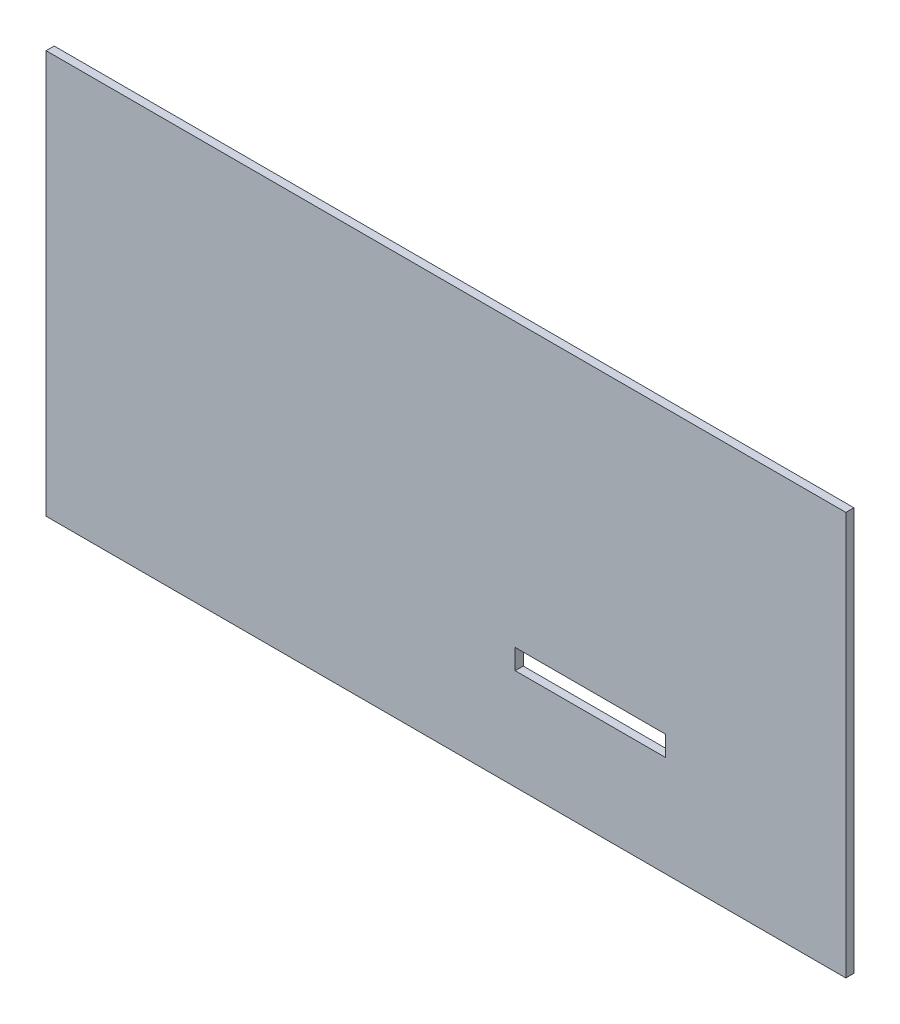
ISO-10303-21;
HEADER;
FILE_DESCRIPTION(('STEP AP214'),'2;1');
FILE_NAME('part.step','',(''),(''),'','','');
FILE_SCHEMA(('AUTOMOTIVE_DESIGN { 1 0 10303 214 1 1 1 1 }'));
ENDSEC;
DATA;
#1=APPLICATION_CONTEXT('core data for automotive mechanical design processes');
#2=APPLICATION_PROTOCOL_DEFINITION('international standard','automotive_design',2000,#1);
#3=PRODUCT_CONTEXT('',#1,'mechanical');
#4=PRODUCT('Part','Part','',(#3));
#5=PRODUCT_RELATED_PRODUCT_CATEGORY('part','',(#4));
#6=PRODUCT_DEFINITION_FORMATION('','',#4);
#7=PRODUCT_DEFINITION_CONTEXT('part definition',#1,'design');
#8=PRODUCT_DEFINITION('design','',#6,#7);
#9=PRODUCT_DEFINITION_SHAPE('','',#8);
#10=(LENGTH_UNIT() NAMED_UNIT(*) SI_UNIT(.MILLI.,.METRE.));
#11=(NAMED_UNIT(*) PLANE_ANGLE_UNIT() SI_UNIT($,.RADIAN.));
#12=(NAMED_UNIT(*) SI_UNIT($,.STERADIAN.) SOLID_ANGLE_UNIT());
#13=UNCERTAINTY_MEASURE_WITH_UNIT(LENGTH_MEASURE(1.E-05),#10,'distance_accuracy_value','');
#14=(GEOMETRIC_REPRESENTATION_CONTEXT(3) GLOBAL_UNCERTAINTY_ASSIGNED_CONTEXT((#13)) GLOBAL_UNIT_ASSIGNED_CONTEXT((#10,
#11,#12)) REPRESENTATION_CONTEXT('',''));
#15=CARTESIAN_POINT('',(0.,0.,0.));
#16=DIRECTION('',(0.,0.,1.));
#17=DIRECTION('',(1.,0.,0.));
#18=AXIS2_PLACEMENT_3D('',#15,#16,#17);
#19=CARTESIAN_POINT('',(0.,0.,6.));
#20=DIRECTION('',(0.,0.,1.));
#21=DIRECTION('',(1.,0.,0.));
#22=AXIS2_PLACEMENT_3D('',#19,#20,#21);
#23=PLANE('',#22);
#24=DIRECTION('',(0.,1.,0.));
#25=VECTOR('',#24,1.);
#26=CARTESIAN_POINT('',(297.5,150.,6.));
#27=LINE('',#26,#25);
#28=CARTESIAN_POINT('',(297.5,-150.,6.));
#29=VERTEX_POINT('',#28);
#30=CARTESIAN_POINT('',(297.5,150.,6.));
#31=VERTEX_POINT('',#30);
#32=EDGE_CURVE('E137',#29,#31,#27,.T.);
#33=ORIENTED_EDGE('',*,*,#32,.T.);
#34=DIRECTION('',(-1.,0.,0.));
#35=VECTOR('',#34,1.);
#36=CARTESIAN_POINT('',(-297.5,150.,6.));
#37=LINE('',#36,#35);
#38=CARTESIAN_POINT('',(-297.5,150.,6.));
#39=VERTEX_POINT('',#38);
#40=EDGE_CURVE('E140',#31,#39,#37,.T.);
#41=ORIENTED_EDGE('',*,*,#40,.T.);
#42=DIRECTION('',(0.,-1.,0.));
#43=VECTOR('',#42,1.);
#44=CARTESIAN_POINT('',(-297.5,150.,6.));
#45=LINE('',#44,#43);
#46=CARTESIAN_POINT('',(-297.5,-150.,6.));
#47=VERTEX_POINT('',#46);
#48=EDGE_CURVE('E143',#39,#47,#45,.T.);
#49=ORIENTED_EDGE('',*,*,#48,.T.);
#50=DIRECTION('',(1.,0.,0.));
#51=VECTOR('',#50,1.);
#52=CARTESIAN_POINT('',(-297.5,-150.,6.));
#53=LINE('',#52,#51);
#54=EDGE_CURVE('E145',#47,#29,#53,.T.);
#55=ORIENTED_EDGE('',*,*,#54,.T.);
#56=EDGE_LOOP('',(#33,#41,#49,#55));
#57=FACE_BOUND('',#56,.T.);
#58=DIRECTION('',(0.,-1.,0.));
#59=VECTOR('',#58,1.);
#60=CARTESIAN_POINT('',(51.5000000000001,0.,6.));
#61=LINE('',#60,#59);
#62=CARTESIAN_POINT('',(51.5,-60.,6.));
#63=VERTEX_POINT('',#62);
#64=CARTESIAN_POINT('',(51.5,-75.,6.));
#65=VERTEX_POINT('',#64);
#66=EDGE_CURVE('E127',#63,#65,#61,.T.);
#67=ORIENTED_EDGE('',*,*,#66,.F.);
#68=DIRECTION('',(1.,0.,0.));
#69=VECTOR('',#68,1.);
#70=CARTESIAN_POINT('',(0.,-60.,6.));
#71=LINE('',#70,#69);
#72=CARTESIAN_POINT('',(163.5,-60.,6.));
#73=VERTEX_POINT('',#72);
#74=EDGE_CURVE('E52',#63,#73,#71,.T.);
#75=ORIENTED_EDGE('',*,*,#74,.T.);
#76=DIRECTION('',(0.,-1.,0.));
#77=VECTOR('',#76,1.);
#78=CARTESIAN_POINT('',(163.5,-3.02535774210356E-13,6.));
#79=LINE('',#78,#77);
#80=CARTESIAN_POINT('',(163.5,-75.,6.));
#81=VERTEX_POINT('',#80);
#82=EDGE_CURVE('E118',#73,#81,#79,.T.);
#83=ORIENTED_EDGE('',*,*,#82,.T.);
#84=DIRECTION('',(-1.,0.,0.));
#85=VECTOR('',#84,1.);
#86=CARTESIAN_POINT('',(0.,-75.,6.));
#87=LINE('',#86,#85);
#88=EDGE_CURVE('E121',#81,#65,#87,.T.);
#89=ORIENTED_EDGE('',*,*,#88,.T.);
#90=EDGE_LOOP('',(#67,#75,#83,#89));
#91=FACE_BOUND('',#90,.T.);
#92=ADVANCED_FACE('F37',(#57,#91),#23,.T.);
#93=CARTESIAN_POINT('',(0.,0.,0.));
#94=DIRECTION('',(0.,0.,1.));
#95=DIRECTION('',(1.,0.,0.));
#96=AXIS2_PLACEMENT_3D('',#93,#94,#95);
#97=PLANE('',#96);
#98=DIRECTION('',(0.,1.,0.));
#99=VECTOR('',#98,1.);
#100=CARTESIAN_POINT('',(297.5,150.,0.));
#101=LINE('',#100,#99);
#102=CARTESIAN_POINT('',(297.5,-150.,0.));
#103=VERTEX_POINT('',#102);
#104=CARTESIAN_POINT('',(297.5,150.,0.));
#105=VERTEX_POINT('',#104);
#106=EDGE_CURVE('E133',#103,#105,#101,.T.);
#107=ORIENTED_EDGE('',*,*,#106,.F.);
#108=DIRECTION('',(1.,0.,0.));
#109=VECTOR('',#108,1.);
#110=CARTESIAN_POINT('',(-297.5,-150.,0.));
#111=LINE('',#110,#109);
#112=CARTESIAN_POINT('',(-297.5,-150.,0.));
#113=VERTEX_POINT('',#112);
#114=EDGE_CURVE('E141',#113,#103,#111,.T.);
#115=ORIENTED_EDGE('',*,*,#114,.F.);
#116=DIRECTION('',(0.,-1.,0.));
#117=VECTOR('',#116,1.);
#118=CARTESIAN_POINT('',(-297.5,150.,0.));
#119=LINE('',#118,#117);
#120=CARTESIAN_POINT('',(-297.5,150.,0.));
#121=VERTEX_POINT('',#120);
#122=EDGE_CURVE('E152',#121,#113,#119,.T.);
#123=ORIENTED_EDGE('',*,*,#122,.F.);
#124=DIRECTION('',(-1.,0.,0.));
#125=VECTOR('',#124,1.);
#126=CARTESIAN_POINT('',(-297.5,150.,0.));
#127=LINE('',#126,#125);
#128=EDGE_CURVE('E150',#105,#121,#127,.T.);
#129=ORIENTED_EDGE('',*,*,#128,.F.);
#130=EDGE_LOOP('',(#107,#115,#123,#129));
#131=FACE_BOUND('',#130,.T.);
#132=DIRECTION('',(1.,0.,0.));
#133=VECTOR('',#132,1.);
#134=CARTESIAN_POINT('',(0.,-60.,0.));
#135=LINE('',#134,#133);
#136=CARTESIAN_POINT('',(51.5,-60.,0.));
#137=VERTEX_POINT('',#136);
#138=CARTESIAN_POINT('',(163.5,-60.,0.));
#139=VERTEX_POINT('',#138);
#140=EDGE_CURVE('E104',#137,#139,#135,.T.);
#141=ORIENTED_EDGE('',*,*,#140,.F.);
#142=DIRECTION('',(0.,-1.,0.));
#143=VECTOR('',#142,1.);
#144=CARTESIAN_POINT('',(51.5000000000001,0.,0.));
#145=LINE('',#144,#143);
#146=CARTESIAN_POINT('',(51.5,-75.,0.));
#147=VERTEX_POINT('',#146);
#148=EDGE_CURVE('E110',#137,#147,#145,.T.);
#149=ORIENTED_EDGE('',*,*,#148,.T.);
#150=DIRECTION('',(-1.,0.,0.));
#151=VECTOR('',#150,1.);
#152=CARTESIAN_POINT('',(0.,-75.,0.));
#153=LINE('',#152,#151);
#154=CARTESIAN_POINT('',(163.5,-75.,0.));
#155=VERTEX_POINT('',#154);
#156=EDGE_CURVE('E114',#155,#147,#153,.T.);
#157=ORIENTED_EDGE('',*,*,#156,.F.);
#158=DIRECTION('',(0.,-1.,0.));
#159=VECTOR('',#158,1.);
#160=CARTESIAN_POINT('',(163.5,-3.02535774210356E-13,0.));
#161=LINE('',#160,#159);
#162=EDGE_CURVE('E107',#139,#155,#161,.T.);
#163=ORIENTED_EDGE('',*,*,#162,.F.);
#164=EDGE_LOOP('',(#141,#149,#157,#163));
#165=FACE_BOUND('',#164,.T.);
#166=ADVANCED_FACE('F117',(#131,#165),#97,.F.);
#167=CARTESIAN_POINT('',(297.5,150.,6.));
#168=DIRECTION('',(-1.,0.,0.));
#169=DIRECTION('',(0.,0.,1.));
#170=AXIS2_PLACEMENT_3D('',#167,#168,#169);
#171=PLANE('',#170);
#172=ORIENTED_EDGE('',*,*,#106,.T.);
#173=DIRECTION('',(0.,0.,-1.));
#174=VECTOR('',#173,1.);
#175=CARTESIAN_POINT('',(297.5,150.,6.));
#176=LINE('',#175,#174);
#177=EDGE_CURVE('E11',#31,#105,#176,.T.);
#178=ORIENTED_EDGE('',*,*,#177,.F.);
#179=ORIENTED_EDGE('',*,*,#32,.F.);
#180=DIRECTION('',(0.,0.,-1.));
#181=VECTOR('',#180,1.);
#182=CARTESIAN_POINT('',(297.5,-150.,6.));
#183=LINE('',#182,#181);
#184=EDGE_CURVE('E147',#29,#103,#183,.T.);
#185=ORIENTED_EDGE('',*,*,#184,.T.);
#186=EDGE_LOOP('',(#172,#178,#179,#185));
#187=FACE_BOUND('',#186,.T.);
#188=ADVANCED_FACE('F39',(#187),#171,.F.);
#189=CARTESIAN_POINT('',(-297.5,150.,6.));
#190=DIRECTION('',(0.,-1.,0.));
#191=DIRECTION('',(0.,0.,-1.));
#192=AXIS2_PLACEMENT_3D('',#189,#190,#191);
#193=PLANE('',#192);
#194=ORIENTED_EDGE('',*,*,#128,.T.);
#195=DIRECTION('',(0.,0.,-1.));
#196=VECTOR('',#195,1.);
#197=CARTESIAN_POINT('',(-297.5,150.,6.));
#198=LINE('',#197,#196);
#199=EDGE_CURVE('E45',#39,#121,#198,.T.);
#200=ORIENTED_EDGE('',*,*,#199,.F.);
#201=ORIENTED_EDGE('',*,*,#40,.F.);
#202=ORIENTED_EDGE('',*,*,#177,.T.);
#203=EDGE_LOOP('',(#194,#200,#201,#202));
#204=FACE_BOUND('',#203,.T.);
#205=ADVANCED_FACE('F179',(#204),#193,.F.);
#206=CARTESIAN_POINT('',(-297.5,150.,6.));
#207=DIRECTION('',(1.,0.,0.));
#208=DIRECTION('',(0.,0.,-1.));
#209=AXIS2_PLACEMENT_3D('',#206,#207,#208);
#210=PLANE('',#209);
#211=ORIENTED_EDGE('',*,*,#122,.T.);
#212=DIRECTION('',(0.,0.,-1.));
#213=VECTOR('',#212,1.);
#214=CARTESIAN_POINT('',(-297.5,-150.,6.));
#215=LINE('',#214,#213);
#216=EDGE_CURVE('E157',#47,#113,#215,.T.);
#217=ORIENTED_EDGE('',*,*,#216,.F.);
#218=ORIENTED_EDGE('',*,*,#48,.F.);
#219=ORIENTED_EDGE('',*,*,#199,.T.);
#220=EDGE_LOOP('',(#211,#217,#218,#219));
#221=FACE_BOUND('',#220,.T.);
#222=ADVANCED_FACE('F164',(#221),#210,.F.);
#223=CARTESIAN_POINT('',(-297.5,-150.,6.));
#224=DIRECTION('',(0.,1.,0.));
#225=DIRECTION('',(0.,0.,1.));
#226=AXIS2_PLACEMENT_3D('',#223,#224,#225);
#227=PLANE('',#226);
#228=ORIENTED_EDGE('',*,*,#114,.T.);
#229=ORIENTED_EDGE('',*,*,#184,.F.);
#230=ORIENTED_EDGE('',*,*,#54,.F.);
#231=ORIENTED_EDGE('',*,*,#216,.T.);
#232=EDGE_LOOP('',(#228,#229,#230,#231));
#233=FACE_BOUND('',#232,.T.);
#234=ADVANCED_FACE('F172',(#233),#227,.F.);
#235=CARTESIAN_POINT('',(0.,-60.,0.));
#236=DIRECTION('',(0.,-1.,0.));
#237=DIRECTION('',(0.,0.,-1.));
#238=AXIS2_PLACEMENT_3D('',#235,#236,#237);
#239=PLANE('',#238);
#240=ORIENTED_EDGE('',*,*,#74,.F.);
#241=DIRECTION('',(0.,0.,1.));
#242=VECTOR('',#241,1.);
#243=CARTESIAN_POINT('',(51.5,-60.,0.));
#244=LINE('',#243,#242);
#245=EDGE_CURVE('E101',#137,#63,#244,.T.);
#246=ORIENTED_EDGE('',*,*,#245,.F.);
#247=ORIENTED_EDGE('',*,*,#140,.T.);
#248=DIRECTION('',(0.,0.,1.));
#249=VECTOR('',#248,1.);
#250=CARTESIAN_POINT('',(163.5,-60.,0.));
#251=LINE('',#250,#249);
#252=EDGE_CURVE('E131',#139,#73,#251,.T.);
#253=ORIENTED_EDGE('',*,*,#252,.T.);
#254=EDGE_LOOP('',(#240,#246,#247,#253));
#255=FACE_BOUND('',#254,.T.);
#256=ADVANCED_FACE('F102',(#255),#239,.T.);
#257=CARTESIAN_POINT('',(163.5,-3.02535774210356E-13,0.));
#258=DIRECTION('',(-1.,0.,0.));
#259=DIRECTION('',(0.,-1.,0.));
#260=AXIS2_PLACEMENT_3D('',#257,#258,#259);
#261=PLANE('',#260);
#262=ORIENTED_EDGE('',*,*,#82,.F.);
#263=ORIENTED_EDGE('',*,*,#252,.F.);
#264=ORIENTED_EDGE('',*,*,#162,.T.);
#265=DIRECTION('',(0.,0.,1.));
#266=VECTOR('',#265,1.);
#267=CARTESIAN_POINT('',(163.5,-75.,0.));
#268=LINE('',#267,#266);
#269=EDGE_CURVE('E134',#155,#81,#268,.T.);
#270=ORIENTED_EDGE('',*,*,#269,.T.);
#271=EDGE_LOOP('',(#262,#263,#264,#270));
#272=FACE_BOUND('',#271,.T.);
#273=ADVANCED_FACE('F200',(#272),#261,.T.);
#274=CARTESIAN_POINT('',(0.,-75.,0.));
#275=DIRECTION('',(0.,1.,0.));
#276=DIRECTION('',(-1.,0.,0.));
#277=AXIS2_PLACEMENT_3D('',#274,#275,#276);
#278=PLANE('',#277);
#279=ORIENTED_EDGE('',*,*,#88,.F.);
#280=ORIENTED_EDGE('',*,*,#269,.F.);
#281=ORIENTED_EDGE('',*,*,#156,.T.);
#282=DIRECTION('',(0.,0.,1.));
#283=VECTOR('',#282,1.);
#284=CARTESIAN_POINT('',(51.5,-75.,0.));
#285=LINE('',#284,#283);
#286=EDGE_CURVE('E60',#147,#65,#285,.T.);
#287=ORIENTED_EDGE('',*,*,#286,.T.);
#288=EDGE_LOOP('',(#279,#280,#281,#287));
#289=FACE_BOUND('',#288,.T.);
#290=ADVANCED_FACE('F205',(#289),#278,.T.);
#291=CARTESIAN_POINT('',(51.5000000000001,0.,0.));
#292=DIRECTION('',(-1.,0.,0.));
#293=DIRECTION('',(0.,-1.,0.));
#294=AXIS2_PLACEMENT_3D('',#291,#292,#293);
#295=PLANE('',#294);
#296=ORIENTED_EDGE('',*,*,#66,.T.);
#297=ORIENTED_EDGE('',*,*,#286,.F.);
#298=ORIENTED_EDGE('',*,*,#148,.F.);
#299=ORIENTED_EDGE('',*,*,#245,.T.);
#300=EDGE_LOOP('',(#296,#297,#298,#299));
#301=FACE_BOUND('',#300,.T.);
#302=ADVANCED_FACE('F111',(#301),#295,.F.);
#303=CLOSED_SHELL('',(#92,#166,#188,#205,#222,#234,#256,#273,#290,#302));
#304=MANIFOLD_SOLID_BREP('B2',#303);
#305=ADVANCED_BREP_SHAPE_REPRESENTATION('',(#18,#304),#14);
#306=SHAPE_DEFINITION_REPRESENTATION(#9,#305);
ENDSEC;
END-ISO-10303-21;
